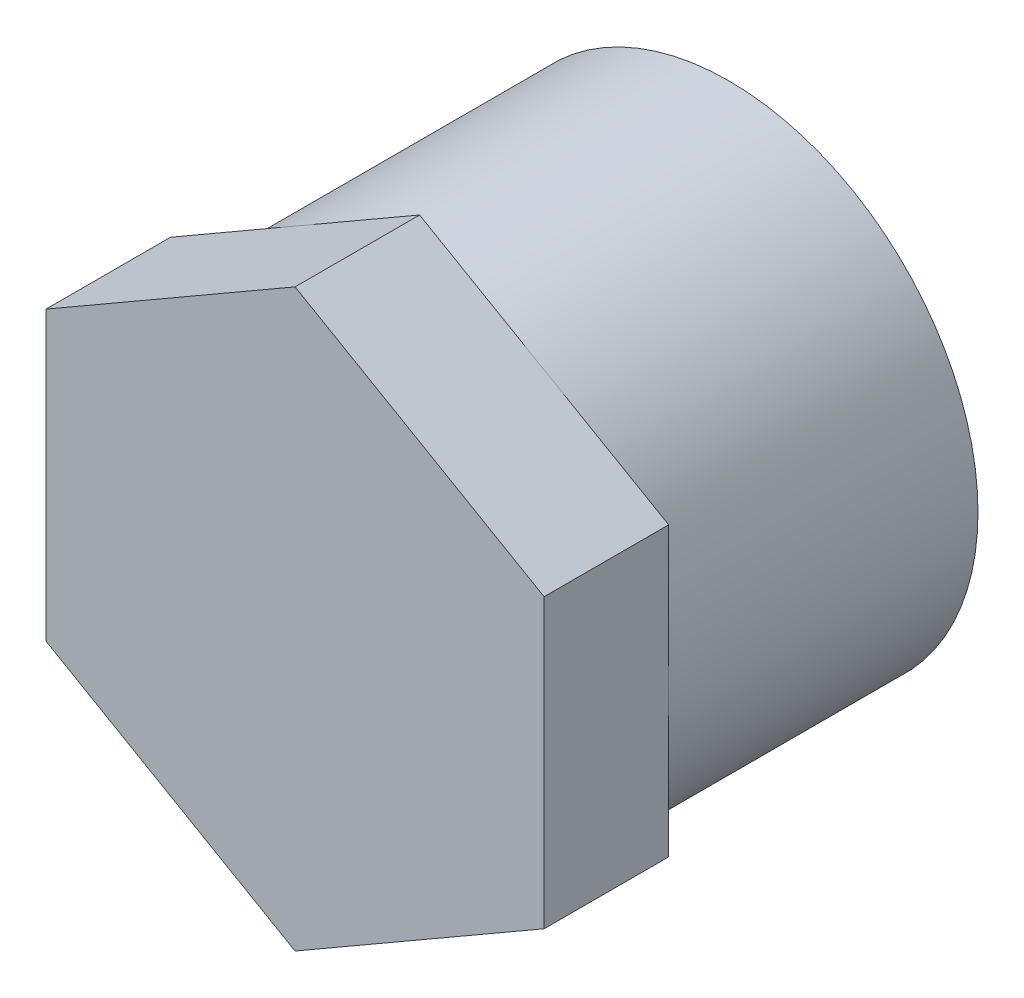
ISO-10303-21;
HEADER;
FILE_DESCRIPTION(('STEP AP214'),'2;1');
FILE_NAME('part.step','',(''),(''),'','','');
FILE_SCHEMA(('AUTOMOTIVE_DESIGN { 1 0 10303 214 1 1 1 1 }'));
ENDSEC;
DATA;
#1=APPLICATION_CONTEXT('core data for automotive mechanical design processes');
#2=APPLICATION_PROTOCOL_DEFINITION('international standard','automotive_design',2000,#1);
#3=PRODUCT_CONTEXT('',#1,'mechanical');
#4=PRODUCT('Part','Part','',(#3));
#5=PRODUCT_RELATED_PRODUCT_CATEGORY('part','',(#4));
#6=PRODUCT_DEFINITION_FORMATION('','',#4);
#7=PRODUCT_DEFINITION_CONTEXT('part definition',#1,'design');
#8=PRODUCT_DEFINITION('design','',#6,#7);
#9=PRODUCT_DEFINITION_SHAPE('','',#8);
#10=(LENGTH_UNIT() NAMED_UNIT(*) SI_UNIT(.MILLI.,.METRE.));
#11=(NAMED_UNIT(*) PLANE_ANGLE_UNIT() SI_UNIT($,.RADIAN.));
#12=(NAMED_UNIT(*) SI_UNIT($,.STERADIAN.) SOLID_ANGLE_UNIT());
#13=UNCERTAINTY_MEASURE_WITH_UNIT(LENGTH_MEASURE(1.E-05),#10,'distance_accuracy_value','');
#14=(GEOMETRIC_REPRESENTATION_CONTEXT(3) GLOBAL_UNCERTAINTY_ASSIGNED_CONTEXT((#13)) GLOBAL_UNIT_ASSIGNED_CONTEXT((#10,
#11,#12)) REPRESENTATION_CONTEXT('',''));
#15=CARTESIAN_POINT('',(0.,0.,0.));
#16=DIRECTION('',(0.,0.,1.));
#17=DIRECTION('',(1.,0.,0.));
#18=AXIS2_PLACEMENT_3D('',#15,#16,#17);
#19=CARTESIAN_POINT('',(0.,0.,-7.42));
#20=DIRECTION('',(0.,0.,1.));
#21=DIRECTION('',(1.,0.,0.));
#22=AXIS2_PLACEMENT_3D('',#19,#20,#21);
#23=CYLINDRICAL_SURFACE('',#22,10.);
#24=CARTESIAN_POINT('',(0.,0.,-7.42));
#25=DIRECTION('',(0.,0.,1.));
#26=DIRECTION('',(1.,0.,0.));
#27=AXIS2_PLACEMENT_3D('',#24,#25,#26);
#28=CIRCLE('',#27,10.);
#29=CARTESIAN_POINT('',(10.,0.,-7.42));
#30=VERTEX_POINT('',#29);
#31=EDGE_CURVE('E11',#30,#30,#28,.T.);
#32=ORIENTED_EDGE('',*,*,#31,.T.);
#33=EDGE_LOOP('',(#32));
#34=FACE_BOUND('',#33,.T.);
#35=CARTESIAN_POINT('',(0.,0.,5.));
#36=DIRECTION('',(0.,0.,1.));
#37=DIRECTION('',(1.,0.,0.));
#38=AXIS2_PLACEMENT_3D('',#35,#36,#37);
#39=CIRCLE('',#38,10.);
#40=CARTESIAN_POINT('',(9.99999999999999,0.,5.));
#41=VERTEX_POINT('',#40);
#42=CARTESIAN_POINT('',(5.,8.66025403784439,5.));
#43=VERTEX_POINT('',#42);
#44=EDGE_CURVE('E39',#41,#43,#39,.T.);
#45=ORIENTED_EDGE('',*,*,#44,.F.);
#46=CARTESIAN_POINT('',(5.,-8.66025403784439,5.));
#47=VERTEX_POINT('',#46);
#48=EDGE_CURVE('E46',#47,#41,#39,.T.);
#49=ORIENTED_EDGE('',*,*,#48,.F.);
#50=CARTESIAN_POINT('',(-5.,-8.66025403784439,5.));
#51=VERTEX_POINT('',#50);
#52=EDGE_CURVE('E50',#51,#47,#39,.T.);
#53=ORIENTED_EDGE('',*,*,#52,.F.);
#54=CARTESIAN_POINT('',(-10.,0.,5.));
#55=VERTEX_POINT('',#54);
#56=EDGE_CURVE('E141',#55,#51,#39,.T.);
#57=ORIENTED_EDGE('',*,*,#56,.F.);
#58=CARTESIAN_POINT('',(-5.,8.66025403784439,5.));
#59=VERTEX_POINT('',#58);
#60=EDGE_CURVE('E137',#59,#55,#39,.T.);
#61=ORIENTED_EDGE('',*,*,#60,.F.);
#62=EDGE_CURVE('E132',#43,#59,#39,.T.);
#63=ORIENTED_EDGE('',*,*,#62,.F.);
#64=EDGE_LOOP('',(#45,#49,#53,#57,#61,#63));
#65=FACE_BOUND('',#64,.T.);
#66=ADVANCED_FACE('F32',(#34,#65),#23,.T.);
#67=CARTESIAN_POINT('',(0.,0.,-7.42));
#68=DIRECTION('',(0.,0.,1.));
#69=DIRECTION('',(1.,0.,0.));
#70=AXIS2_PLACEMENT_3D('',#67,#68,#69);
#71=PLANE('',#70);
#72=ORIENTED_EDGE('',*,*,#31,.F.);
#73=EDGE_LOOP('',(#72));
#74=FACE_BOUND('',#73,.T.);
#75=ADVANCED_FACE('F217',(#74),#71,.F.);
#76=CARTESIAN_POINT('',(0.,0.,5.));
#77=DIRECTION('',(0.,0.,1.));
#78=DIRECTION('',(1.,0.,0.));
#79=AXIS2_PLACEMENT_3D('',#76,#77,#78);
#80=PLANE('',#79);
#81=DIRECTION('',(0.,1.,0.));
#82=VECTOR('',#81,1.);
#83=CARTESIAN_POINT('',(9.99999999999999,-5.77350269189626,5.));
#84=LINE('',#83,#82);
#85=CARTESIAN_POINT('',(9.99999999999999,5.77350269189626,5.));
#86=VERTEX_POINT('',#85);
#87=EDGE_CURVE('E171',#41,#86,#84,.T.);
#88=ORIENTED_EDGE('',*,*,#87,.F.);
#89=ORIENTED_EDGE('',*,*,#44,.T.);
#90=DIRECTION('',(-0.866025403784439,0.5,0.));
#91=VECTOR('',#90,1.);
#92=CARTESIAN_POINT('',(9.99999999999999,5.77350269189626,5.));
#93=LINE('',#92,#91);
#94=EDGE_CURVE('E195',#86,#43,#93,.T.);
#95=ORIENTED_EDGE('',*,*,#94,.F.);
#96=EDGE_LOOP('',(#88,#89,#95));
#97=FACE_BOUND('',#96,.T.);
#98=ADVANCED_FACE('F204',(#97),#80,.F.);
#99=CARTESIAN_POINT('',(0.,11.5470053837925,5.));
#100=VERTEX_POINT('',#99);
#101=EDGE_CURVE('E125',#43,#100,#93,.T.);
#102=ORIENTED_EDGE('',*,*,#101,.F.);
#103=ORIENTED_EDGE('',*,*,#62,.T.);
#104=DIRECTION('',(-0.866025403784439,-0.5,0.));
#105=VECTOR('',#104,1.);
#106=CARTESIAN_POINT('',(0.,11.5470053837925,5.));
#107=LINE('',#106,#105);
#108=EDGE_CURVE('E191',#100,#59,#107,.T.);
#109=ORIENTED_EDGE('',*,*,#108,.F.);
#110=EDGE_LOOP('',(#102,#103,#109));
#111=FACE_BOUND('',#110,.T.);
#112=ADVANCED_FACE('F203',(#111),#80,.F.);
#113=CARTESIAN_POINT('',(-10.,5.77350269189626,5.));
#114=VERTEX_POINT('',#113);
#115=EDGE_CURVE('E194',#59,#114,#107,.T.);
#116=ORIENTED_EDGE('',*,*,#115,.F.);
#117=ORIENTED_EDGE('',*,*,#60,.T.);
#118=DIRECTION('',(0.,-1.,0.));
#119=VECTOR('',#118,1.);
#120=CARTESIAN_POINT('',(-10.,5.77350269189626,5.));
#121=LINE('',#120,#119);
#122=EDGE_CURVE('E190',#114,#55,#121,.T.);
#123=ORIENTED_EDGE('',*,*,#122,.F.);
#124=EDGE_LOOP('',(#116,#117,#123));
#125=FACE_BOUND('',#124,.T.);
#126=ADVANCED_FACE('F202',(#125),#80,.F.);
#127=CARTESIAN_POINT('',(-10.,-5.77350269189626,5.));
#128=VERTEX_POINT('',#127);
#129=EDGE_CURVE('E188',#55,#128,#121,.T.);
#130=ORIENTED_EDGE('',*,*,#129,.F.);
#131=ORIENTED_EDGE('',*,*,#56,.T.);
#132=DIRECTION('',(0.866025403784439,-0.5,0.));
#133=VECTOR('',#132,1.);
#134=CARTESIAN_POINT('',(-10.,-5.77350269189626,5.));
#135=LINE('',#134,#133);
#136=EDGE_CURVE('E164',#128,#51,#135,.T.);
#137=ORIENTED_EDGE('',*,*,#136,.F.);
#138=EDGE_LOOP('',(#130,#131,#137));
#139=FACE_BOUND('',#138,.T.);
#140=ADVANCED_FACE('F187',(#139),#80,.F.);
#141=CARTESIAN_POINT('',(0.,-11.5470053837925,5.));
#142=VERTEX_POINT('',#141);
#143=EDGE_CURVE('E154',#51,#142,#135,.T.);
#144=ORIENTED_EDGE('',*,*,#143,.F.);
#145=ORIENTED_EDGE('',*,*,#52,.T.);
#146=DIRECTION('',(0.866025403784439,0.5,0.));
#147=VECTOR('',#146,1.);
#148=CARTESIAN_POINT('',(0.,-11.5470053837925,5.));
#149=LINE('',#148,#147);
#150=EDGE_CURVE('E153',#142,#47,#149,.T.);
#151=ORIENTED_EDGE('',*,*,#150,.F.);
#152=EDGE_LOOP('',(#144,#145,#151));
#153=FACE_BOUND('',#152,.T.);
#154=ADVANCED_FACE('F151',(#153),#80,.F.);
#155=CARTESIAN_POINT('',(9.99999999999999,-5.77350269189626,5.));
#156=VERTEX_POINT('',#155);
#157=EDGE_CURVE('E158',#47,#156,#149,.T.);
#158=ORIENTED_EDGE('',*,*,#157,.F.);
#159=ORIENTED_EDGE('',*,*,#48,.T.);
#160=EDGE_CURVE('E120',#156,#41,#84,.T.);
#161=ORIENTED_EDGE('',*,*,#160,.F.);
#162=EDGE_LOOP('',(#158,#159,#161));
#163=FACE_BOUND('',#162,.T.);
#164=ADVANCED_FACE('F159',(#163),#80,.F.);
#165=CARTESIAN_POINT('',(9.99999999999999,5.77350269189626,10.));
#166=DIRECTION('',(-0.5,-0.866025403784439,0.));
#167=DIRECTION('',(0.866025403784439,-0.5,0.));
#168=AXIS2_PLACEMENT_3D('',#165,#166,#167);
#169=PLANE('',#168);
#170=ORIENTED_EDGE('',*,*,#94,.T.);
#171=ORIENTED_EDGE('',*,*,#101,.T.);
#172=DIRECTION('',(0.,0.,-1.));
#173=VECTOR('',#172,1.);
#174=CARTESIAN_POINT('',(0.,11.5470053837925,10.));
#175=LINE('',#174,#173);
#176=CARTESIAN_POINT('',(0.,11.5470053837925,10.));
#177=VERTEX_POINT('',#176);
#178=EDGE_CURVE('E105',#177,#100,#175,.T.);
#179=ORIENTED_EDGE('',*,*,#178,.F.);
#180=DIRECTION('',(-0.866025403784439,0.5,0.));
#181=VECTOR('',#180,1.);
#182=CARTESIAN_POINT('',(9.99999999999999,5.77350269189626,10.));
#183=LINE('',#182,#181);
#184=CARTESIAN_POINT('',(9.99999999999999,5.77350269189626,10.));
#185=VERTEX_POINT('',#184);
#186=EDGE_CURVE('E111',#185,#177,#183,.T.);
#187=ORIENTED_EDGE('',*,*,#186,.F.);
#188=DIRECTION('',(0.,0.,-1.));
#189=VECTOR('',#188,1.);
#190=CARTESIAN_POINT('',(9.99999999999999,5.77350269189626,10.));
#191=LINE('',#190,#189);
#192=EDGE_CURVE('E176',#185,#86,#191,.T.);
#193=ORIENTED_EDGE('',*,*,#192,.T.);
#194=EDGE_LOOP('',(#170,#171,#179,#187,#193));
#195=FACE_BOUND('',#194,.T.);
#196=ADVANCED_FACE('F123',(#195),#169,.F.);
#197=CARTESIAN_POINT('',(0.,11.5470053837925,10.));
#198=DIRECTION('',(0.5,-0.866025403784439,0.));
#199=DIRECTION('',(0.866025403784439,0.5,0.));
#200=AXIS2_PLACEMENT_3D('',#197,#198,#199);
#201=PLANE('',#200);
#202=ORIENTED_EDGE('',*,*,#108,.T.);
#203=ORIENTED_EDGE('',*,*,#115,.T.);
#204=DIRECTION('',(0.,0.,-1.));
#205=VECTOR('',#204,1.);
#206=CARTESIAN_POINT('',(-10.,5.77350269189626,10.));
#207=LINE('',#206,#205);
#208=CARTESIAN_POINT('',(-10.,5.77350269189626,10.));
#209=VERTEX_POINT('',#208);
#210=EDGE_CURVE('E107',#209,#114,#207,.T.);
#211=ORIENTED_EDGE('',*,*,#210,.F.);
#212=DIRECTION('',(-0.866025403784439,-0.5,0.));
#213=VECTOR('',#212,1.);
#214=CARTESIAN_POINT('',(0.,11.5470053837925,10.));
#215=LINE('',#214,#213);
#216=EDGE_CURVE('E100',#177,#209,#215,.T.);
#217=ORIENTED_EDGE('',*,*,#216,.F.);
#218=ORIENTED_EDGE('',*,*,#178,.T.);
#219=EDGE_LOOP('',(#202,#203,#211,#217,#218));
#220=FACE_BOUND('',#219,.T.);
#221=ADVANCED_FACE('F103',(#220),#201,.F.);
#222=CARTESIAN_POINT('',(-10.,5.77350269189626,10.));
#223=DIRECTION('',(1.,0.,0.));
#224=DIRECTION('',(0.,0.,-1.));
#225=AXIS2_PLACEMENT_3D('',#222,#223,#224);
#226=PLANE('',#225);
#227=ORIENTED_EDGE('',*,*,#122,.T.);
#228=ORIENTED_EDGE('',*,*,#129,.T.);
#229=DIRECTION('',(0.,0.,-1.));
#230=VECTOR('',#229,1.);
#231=CARTESIAN_POINT('',(-10.,-5.77350269189626,10.));
#232=LINE('',#231,#230);
#233=CARTESIAN_POINT('',(-10.,-5.77350269189626,10.));
#234=VERTEX_POINT('',#233);
#235=EDGE_CURVE('E128',#234,#128,#232,.T.);
#236=ORIENTED_EDGE('',*,*,#235,.F.);
#237=DIRECTION('',(0.,-1.,0.));
#238=VECTOR('',#237,1.);
#239=CARTESIAN_POINT('',(-10.,5.77350269189626,10.));
#240=LINE('',#239,#238);
#241=EDGE_CURVE('E110',#209,#234,#240,.T.);
#242=ORIENTED_EDGE('',*,*,#241,.F.);
#243=ORIENTED_EDGE('',*,*,#210,.T.);
#244=EDGE_LOOP('',(#227,#228,#236,#242,#243));
#245=FACE_BOUND('',#244,.T.);
#246=ADVANCED_FACE('F201',(#245),#226,.F.);
#247=CARTESIAN_POINT('',(-10.,-5.77350269189626,10.));
#248=DIRECTION('',(0.5,0.866025403784438,0.));
#249=DIRECTION('',(-0.866025403784439,0.5,0.));
#250=AXIS2_PLACEMENT_3D('',#247,#248,#249);
#251=PLANE('',#250);
#252=ORIENTED_EDGE('',*,*,#136,.T.);
#253=ORIENTED_EDGE('',*,*,#143,.T.);
#254=DIRECTION('',(0.,0.,-1.));
#255=VECTOR('',#254,1.);
#256=CARTESIAN_POINT('',(0.,-11.5470053837925,10.));
#257=LINE('',#256,#255);
#258=CARTESIAN_POINT('',(0.,-11.5470053837925,10.));
#259=VERTEX_POINT('',#258);
#260=EDGE_CURVE('E170',#259,#142,#257,.T.);
#261=ORIENTED_EDGE('',*,*,#260,.F.);
#262=DIRECTION('',(0.866025403784439,-0.5,0.));
#263=VECTOR('',#262,1.);
#264=CARTESIAN_POINT('',(-10.,-5.77350269189626,10.));
#265=LINE('',#264,#263);
#266=EDGE_CURVE('E185',#234,#259,#265,.T.);
#267=ORIENTED_EDGE('',*,*,#266,.F.);
#268=ORIENTED_EDGE('',*,*,#235,.T.);
#269=EDGE_LOOP('',(#252,#253,#261,#267,#268));
#270=FACE_BOUND('',#269,.T.);
#271=ADVANCED_FACE('F184',(#270),#251,.F.);
#272=CARTESIAN_POINT('',(0.,-11.5470053837925,10.));
#273=DIRECTION('',(-0.5,0.866025403784439,0.));
#274=DIRECTION('',(-0.866025403784439,-0.5,0.));
#275=AXIS2_PLACEMENT_3D('',#272,#273,#274);
#276=PLANE('',#275);
#277=ORIENTED_EDGE('',*,*,#150,.T.);
#278=ORIENTED_EDGE('',*,*,#157,.T.);
#279=DIRECTION('',(0.,0.,-1.));
#280=VECTOR('',#279,1.);
#281=CARTESIAN_POINT('',(9.99999999999999,-5.77350269189626,10.));
#282=LINE('',#281,#280);
#283=CARTESIAN_POINT('',(9.99999999999999,-5.77350269189626,10.));
#284=VERTEX_POINT('',#283);
#285=EDGE_CURVE('E178',#284,#156,#282,.T.);
#286=ORIENTED_EDGE('',*,*,#285,.F.);
#287=DIRECTION('',(0.866025403784439,0.5,0.));
#288=VECTOR('',#287,1.);
#289=CARTESIAN_POINT('',(0.,-11.5470053837925,10.));
#290=LINE('',#289,#288);
#291=EDGE_CURVE('E198',#259,#284,#290,.T.);
#292=ORIENTED_EDGE('',*,*,#291,.F.);
#293=ORIENTED_EDGE('',*,*,#260,.T.);
#294=EDGE_LOOP('',(#277,#278,#286,#292,#293));
#295=FACE_BOUND('',#294,.T.);
#296=ADVANCED_FACE('F167',(#295),#276,.F.);
#297=CARTESIAN_POINT('',(9.99999999999999,-5.77350269189626,10.));
#298=DIRECTION('',(-1.,0.,0.));
#299=DIRECTION('',(0.,0.,1.));
#300=AXIS2_PLACEMENT_3D('',#297,#298,#299);
#301=PLANE('',#300);
#302=ORIENTED_EDGE('',*,*,#160,.T.);
#303=ORIENTED_EDGE('',*,*,#87,.T.);
#304=ORIENTED_EDGE('',*,*,#192,.F.);
#305=DIRECTION('',(0.,1.,0.));
#306=VECTOR('',#305,1.);
#307=CARTESIAN_POINT('',(9.99999999999999,-5.77350269189626,10.));
#308=LINE('',#307,#306);
#309=EDGE_CURVE('E116',#284,#185,#308,.T.);
#310=ORIENTED_EDGE('',*,*,#309,.F.);
#311=ORIENTED_EDGE('',*,*,#285,.T.);
#312=EDGE_LOOP('',(#302,#303,#304,#310,#311));
#313=FACE_BOUND('',#312,.T.);
#314=ADVANCED_FACE('F206',(#313),#301,.F.);
#315=CARTESIAN_POINT('',(0.,0.,10.));
#316=DIRECTION('',(0.,0.,1.));
#317=DIRECTION('',(1.,0.,0.));
#318=AXIS2_PLACEMENT_3D('',#315,#316,#317);
#319=PLANE('',#318);
#320=ORIENTED_EDGE('',*,*,#186,.T.);
#321=ORIENTED_EDGE('',*,*,#216,.T.);
#322=ORIENTED_EDGE('',*,*,#241,.T.);
#323=ORIENTED_EDGE('',*,*,#266,.T.);
#324=ORIENTED_EDGE('',*,*,#291,.T.);
#325=ORIENTED_EDGE('',*,*,#309,.T.);
#326=EDGE_LOOP('',(#320,#321,#322,#323,#324,#325));
#327=FACE_BOUND('',#326,.T.);
#328=ADVANCED_FACE('F114',(#327),#319,.T.);
#329=CLOSED_SHELL('',(#66,#75,#98,#112,#126,#140,#154,#164,#196,#221,#246,#271,#296,#314,#328));
#330=MANIFOLD_SOLID_BREP('B2',#329);
#331=ADVANCED_BREP_SHAPE_REPRESENTATION('',(#18,#330),#14);
#332=SHAPE_DEFINITION_REPRESENTATION(#9,#331);
ENDSEC;
END-ISO-10303-21;
